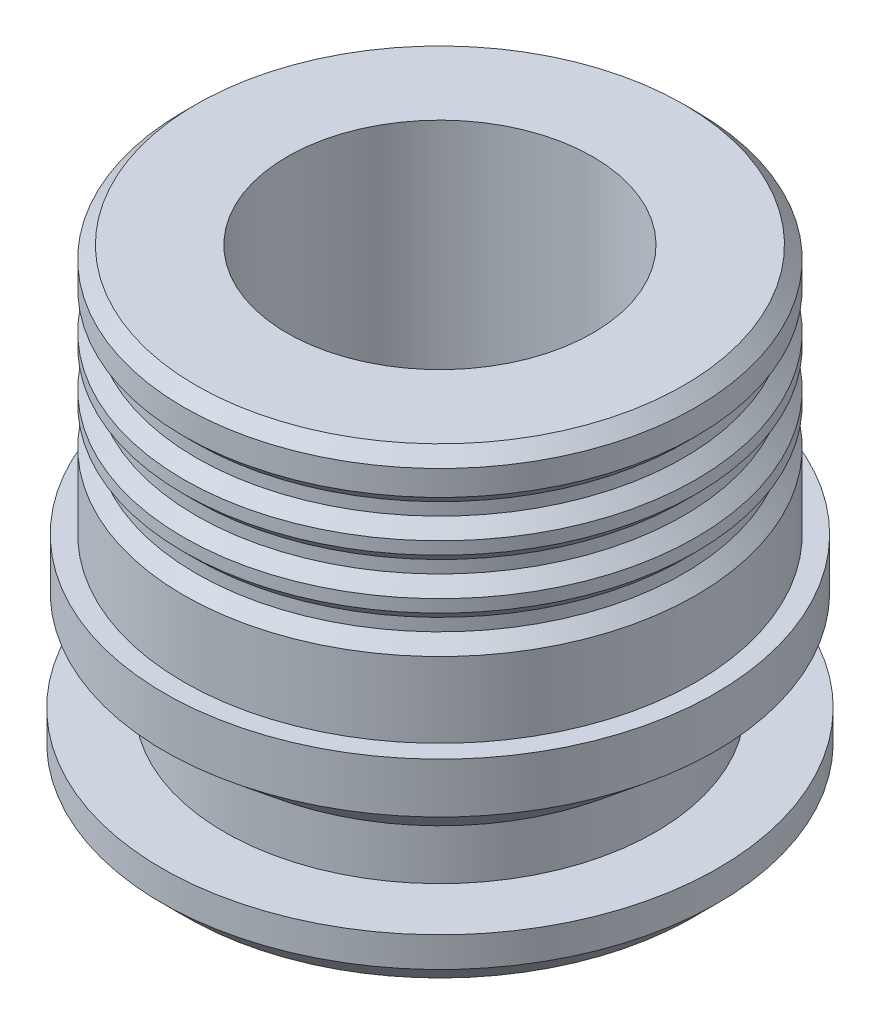
ISO-10303-21;
HEADER;
FILE_DESCRIPTION(('STEP AP214'),'2;1');
FILE_NAME('part.step','',(''),(''),'','','');
FILE_SCHEMA(('AUTOMOTIVE_DESIGN { 1 0 10303 214 1 1 1 1 }'));
ENDSEC;
DATA;
#1=APPLICATION_CONTEXT('core data for automotive mechanical design processes');
#2=APPLICATION_PROTOCOL_DEFINITION('international standard','automotive_design',2000,#1);
#3=PRODUCT_CONTEXT('',#1,'mechanical');
#4=PRODUCT('Part','Part','',(#3));
#5=PRODUCT_RELATED_PRODUCT_CATEGORY('part','',(#4));
#6=PRODUCT_DEFINITION_FORMATION('','',#4);
#7=PRODUCT_DEFINITION_CONTEXT('part definition',#1,'design');
#8=PRODUCT_DEFINITION('design','',#6,#7);
#9=PRODUCT_DEFINITION_SHAPE('','',#8);
#10=(LENGTH_UNIT() NAMED_UNIT(*) SI_UNIT(.MILLI.,.METRE.));
#11=(NAMED_UNIT(*) PLANE_ANGLE_UNIT() SI_UNIT($,.RADIAN.));
#12=(NAMED_UNIT(*) SI_UNIT($,.STERADIAN.) SOLID_ANGLE_UNIT());
#13=UNCERTAINTY_MEASURE_WITH_UNIT(LENGTH_MEASURE(1.E-05),#10,'distance_accuracy_value','');
#14=(GEOMETRIC_REPRESENTATION_CONTEXT(3) GLOBAL_UNCERTAINTY_ASSIGNED_CONTEXT((#13)) GLOBAL_UNIT_ASSIGNED_CONTEXT((#10,
#11,#12)) REPRESENTATION_CONTEXT('',''));
#15=CARTESIAN_POINT('',(0.,0.,0.));
#16=DIRECTION('',(0.,0.,1.));
#17=DIRECTION('',(1.,0.,0.));
#18=AXIS2_PLACEMENT_3D('',#15,#16,#17);
#19=CARTESIAN_POINT('',(0.,0.,-11.1));
#20=DIRECTION('',(0.,-1.,0.));
#21=DIRECTION('',(0.,0.,-1.));
#22=AXIS2_PLACEMENT_3D('',#19,#20,#21);
#23=PLANE('',#22);
#24=CARTESIAN_POINT('',(0.,0.,0.));
#25=DIRECTION('',(0.,-1.,0.));
#26=DIRECTION('',(0.,0.,-1.));
#27=AXIS2_PLACEMENT_3D('',#24,#25,#26);
#28=CIRCLE('',#27,6.6);
#29=CARTESIAN_POINT('',(0.,0.,-6.6));
#30=VERTEX_POINT('',#29);
#31=EDGE_CURVE('E10',#30,#30,#28,.F.);
#32=ORIENTED_EDGE('',*,*,#31,.T.);
#33=EDGE_LOOP('',(#32));
#34=FACE_BOUND('',#33,.T.);
#35=CARTESIAN_POINT('',(0.,0.,0.));
#36=DIRECTION('',(0.,-1.,0.));
#37=DIRECTION('',(0.,0.,-1.));
#38=AXIS2_PLACEMENT_3D('',#35,#36,#37);
#39=CIRCLE('',#38,10.1);
#40=CARTESIAN_POINT('',(0.,0.,-10.1));
#41=VERTEX_POINT('',#40);
#42=EDGE_CURVE('E54',#41,#41,#39,.T.);
#43=ORIENTED_EDGE('',*,*,#42,.T.);
#44=EDGE_LOOP('',(#43));
#45=FACE_BOUND('',#44,.T.);
#46=ADVANCED_FACE('F31',(#34,#45),#23,.T.);
#47=CARTESIAN_POINT('',(0.,0.,0.));
#48=DIRECTION('',(0.,-1.,0.));
#49=DIRECTION('',(0.,0.,-1.));
#50=AXIS2_PLACEMENT_3D('',#47,#48,#49);
#51=CYLINDRICAL_SURFACE('',#50,6.1);
#52=CARTESIAN_POINT('',(0.,0.499999999999995,0.));
#53=DIRECTION('',(0.,-1.,0.));
#54=DIRECTION('',(0.,0.,-1.));
#55=AXIS2_PLACEMENT_3D('',#52,#53,#54);
#56=CIRCLE('',#55,6.1);
#57=CARTESIAN_POINT('',(0.,0.499999999999995,-6.1));
#58=VERTEX_POINT('',#57);
#59=EDGE_CURVE('E38',#58,#58,#56,.T.);
#60=ORIENTED_EDGE('',*,*,#59,.T.);
#61=EDGE_LOOP('',(#60));
#62=FACE_BOUND('',#61,.T.);
#63=CARTESIAN_POINT('',(0.,18.2,0.));
#64=DIRECTION('',(0.,-1.,0.));
#65=DIRECTION('',(0.,0.,-1.));
#66=AXIS2_PLACEMENT_3D('',#63,#64,#65);
#67=CIRCLE('',#66,6.1);
#68=CARTESIAN_POINT('',(0.,18.2,-6.1));
#69=VERTEX_POINT('',#68);
#70=EDGE_CURVE('E57',#69,#69,#67,.T.);
#71=ORIENTED_EDGE('',*,*,#70,.F.);
#72=EDGE_LOOP('',(#71));
#73=FACE_BOUND('',#72,.T.);
#74=ADVANCED_FACE('F133',(#62,#73),#51,.F.);
#75=CARTESIAN_POINT('',(0.,18.2,-6.1));
#76=DIRECTION('',(0.,1.,0.));
#77=DIRECTION('',(0.,0.,1.));
#78=AXIS2_PLACEMENT_3D('',#75,#76,#77);
#79=PLANE('',#78);
#80=CARTESIAN_POINT('',(0.,18.2,0.));
#81=DIRECTION('',(0.,1.,0.));
#82=DIRECTION('',(0.,0.,1.));
#83=AXIS2_PLACEMENT_3D('',#80,#81,#82);
#84=CIRCLE('',#83,9.72499999999999);
#85=CARTESIAN_POINT('',(0.,18.2,9.72499999999999));
#86=VERTEX_POINT('',#85);
#87=EDGE_CURVE('E42',#86,#86,#84,.T.);
#88=ORIENTED_EDGE('',*,*,#87,.T.);
#89=EDGE_LOOP('',(#88));
#90=FACE_BOUND('',#89,.T.);
#91=ORIENTED_EDGE('',*,*,#70,.T.);
#92=EDGE_LOOP('',(#91));
#93=FACE_BOUND('',#92,.T.);
#94=ADVANCED_FACE('F138',(#90,#93),#79,.T.);
#95=CARTESIAN_POINT('',(0.,0.,0.));
#96=DIRECTION('',(0.,-1.,0.));
#97=DIRECTION('',(0.,0.,-1.));
#98=AXIS2_PLACEMENT_3D('',#95,#96,#97);
#99=CYLINDRICAL_SURFACE('',#98,10.225);
#100=CARTESIAN_POINT('',(0.,17.7,0.));
#101=DIRECTION('',(0.,1.,0.));
#102=DIRECTION('',(0.,0.,1.));
#103=AXIS2_PLACEMENT_3D('',#100,#101,#102);
#104=CIRCLE('',#103,10.225);
#105=CARTESIAN_POINT('',(0.,17.7,10.225));
#106=VERTEX_POINT('',#105);
#107=EDGE_CURVE('E46',#106,#106,#104,.F.);
#108=ORIENTED_EDGE('',*,*,#107,.T.);
#109=EDGE_LOOP('',(#108));
#110=FACE_BOUND('',#109,.T.);
#111=CARTESIAN_POINT('',(0.,16.7,0.));
#112=DIRECTION('',(0.,-1.,0.));
#113=DIRECTION('',(0.,0.,-1.));
#114=AXIS2_PLACEMENT_3D('',#111,#112,#113);
#115=CIRCLE('',#114,10.225);
#116=CARTESIAN_POINT('',(0.,16.7,-10.225));
#117=VERTEX_POINT('',#116);
#118=EDGE_CURVE('E60',#117,#117,#115,.T.);
#119=ORIENTED_EDGE('',*,*,#118,.F.);
#120=EDGE_LOOP('',(#119));
#121=FACE_BOUND('',#120,.T.);
#122=ADVANCED_FACE('F156',(#110,#121),#99,.T.);
#123=CARTESIAN_POINT('',(0.,16.2000000492508,0.));
#124=DIRECTION('',(0.,1.,0.));
#125=DIRECTION('',(0.,0.,1.));
#126=AXIS2_PLACEMENT_3D('',#123,#124,#125);
#127=CONICAL_SURFACE('',#126,9.725,0.785398212648328);
#128=ORIENTED_EDGE('',*,*,#118,.T.);
#129=EDGE_LOOP('',(#128));
#130=FACE_BOUND('',#129,.T.);
#131=CARTESIAN_POINT('',(0.,16.2000000492508,0.));
#132=DIRECTION('',(0.,-1.,0.));
#133=DIRECTION('',(0.,0.,-1.));
#134=AXIS2_PLACEMENT_3D('',#131,#132,#133);
#135=CIRCLE('',#134,9.725);
#136=CARTESIAN_POINT('',(0.,16.2000000492508,-9.725));
#137=VERTEX_POINT('',#136);
#138=EDGE_CURVE('E63',#137,#137,#135,.T.);
#139=ORIENTED_EDGE('',*,*,#138,.F.);
#140=EDGE_LOOP('',(#139));
#141=FACE_BOUND('',#140,.T.);
#142=ADVANCED_FACE('F159',(#130,#141),#127,.T.);
#143=CARTESIAN_POINT('',(0.,0.,0.));
#144=DIRECTION('',(0.,-1.,0.));
#145=DIRECTION('',(0.,0.,-1.));
#146=AXIS2_PLACEMENT_3D('',#143,#144,#145);
#147=CYLINDRICAL_SURFACE('',#146,9.725);
#148=ORIENTED_EDGE('',*,*,#138,.T.);
#149=EDGE_LOOP('',(#148));
#150=FACE_BOUND('',#149,.T.);
#151=CARTESIAN_POINT('',(0.,15.7000000492509,0.));
#152=DIRECTION('',(0.,-1.,0.));
#153=DIRECTION('',(0.,0.,-1.));
#154=AXIS2_PLACEMENT_3D('',#151,#152,#153);
#155=CIRCLE('',#154,9.725);
#156=CARTESIAN_POINT('',(0.,15.7000000492509,-9.725));
#157=VERTEX_POINT('',#156);
#158=EDGE_CURVE('E66',#157,#157,#155,.T.);
#159=ORIENTED_EDGE('',*,*,#158,.F.);
#160=EDGE_LOOP('',(#159));
#161=FACE_BOUND('',#160,.T.);
#162=ADVANCED_FACE('F165',(#150,#161),#147,.T.);
#163=CARTESIAN_POINT('',(0.,15.2,0.));
#164=DIRECTION('',(0.,-1.,0.));
#165=DIRECTION('',(0.,0.,-1.));
#166=AXIS2_PLACEMENT_3D('',#163,#164,#165);
#167=CONICAL_SURFACE('',#166,10.225,0.785398114146577);
#168=ORIENTED_EDGE('',*,*,#158,.T.);
#169=EDGE_LOOP('',(#168));
#170=FACE_BOUND('',#169,.T.);
#171=CARTESIAN_POINT('',(0.,15.2,0.));
#172=DIRECTION('',(0.,-1.,0.));
#173=DIRECTION('',(0.,0.,-1.));
#174=AXIS2_PLACEMENT_3D('',#171,#172,#173);
#175=CIRCLE('',#174,10.225);
#176=CARTESIAN_POINT('',(0.,15.2,-10.225));
#177=VERTEX_POINT('',#176);
#178=EDGE_CURVE('E69',#177,#177,#175,.T.);
#179=ORIENTED_EDGE('',*,*,#178,.F.);
#180=EDGE_LOOP('',(#179));
#181=FACE_BOUND('',#180,.T.);
#182=ADVANCED_FACE('F171',(#170,#181),#167,.T.);
#183=CARTESIAN_POINT('',(0.,0.,0.));
#184=DIRECTION('',(0.,-1.,0.));
#185=DIRECTION('',(0.,0.,-1.));
#186=AXIS2_PLACEMENT_3D('',#183,#184,#185);
#187=CYLINDRICAL_SURFACE('',#186,10.225);
#188=ORIENTED_EDGE('',*,*,#178,.T.);
#189=EDGE_LOOP('',(#188));
#190=FACE_BOUND('',#189,.T.);
#191=CARTESIAN_POINT('',(0.,14.7,0.));
#192=DIRECTION('',(0.,-1.,0.));
#193=DIRECTION('',(0.,0.,-1.));
#194=AXIS2_PLACEMENT_3D('',#191,#192,#193);
#195=CIRCLE('',#194,10.225);
#196=CARTESIAN_POINT('',(0.,14.7,-10.225));
#197=VERTEX_POINT('',#196);
#198=EDGE_CURVE('E72',#197,#197,#195,.T.);
#199=ORIENTED_EDGE('',*,*,#198,.F.);
#200=EDGE_LOOP('',(#199));
#201=FACE_BOUND('',#200,.T.);
#202=ADVANCED_FACE('F177',(#190,#201),#187,.T.);
#203=CARTESIAN_POINT('',(0.,14.2000000492509,0.));
#204=DIRECTION('',(0.,1.,0.));
#205=DIRECTION('',(0.,0.,1.));
#206=AXIS2_PLACEMENT_3D('',#203,#204,#205);
#207=CONICAL_SURFACE('',#206,9.725,0.785398212648327);
#208=ORIENTED_EDGE('',*,*,#198,.T.);
#209=EDGE_LOOP('',(#208));
#210=FACE_BOUND('',#209,.T.);
#211=CARTESIAN_POINT('',(0.,14.2000000492509,0.));
#212=DIRECTION('',(0.,-1.,0.));
#213=DIRECTION('',(0.,0.,-1.));
#214=AXIS2_PLACEMENT_3D('',#211,#212,#213);
#215=CIRCLE('',#214,9.725);
#216=CARTESIAN_POINT('',(0.,14.2000000492509,-9.725));
#217=VERTEX_POINT('',#216);
#218=EDGE_CURVE('E75',#217,#217,#215,.T.);
#219=ORIENTED_EDGE('',*,*,#218,.F.);
#220=EDGE_LOOP('',(#219));
#221=FACE_BOUND('',#220,.T.);
#222=ADVANCED_FACE('F183',(#210,#221),#207,.T.);
#223=CARTESIAN_POINT('',(0.,0.,0.));
#224=DIRECTION('',(0.,-1.,0.));
#225=DIRECTION('',(0.,0.,-1.));
#226=AXIS2_PLACEMENT_3D('',#223,#224,#225);
#227=CYLINDRICAL_SURFACE('',#226,9.725);
#228=ORIENTED_EDGE('',*,*,#218,.T.);
#229=EDGE_LOOP('',(#228));
#230=FACE_BOUND('',#229,.T.);
#231=CARTESIAN_POINT('',(0.,13.7000000492509,0.));
#232=DIRECTION('',(0.,-1.,0.));
#233=DIRECTION('',(0.,0.,-1.));
#234=AXIS2_PLACEMENT_3D('',#231,#232,#233);
#235=CIRCLE('',#234,9.725);
#236=CARTESIAN_POINT('',(0.,13.7000000492509,-9.725));
#237=VERTEX_POINT('',#236);
#238=EDGE_CURVE('E78',#237,#237,#235,.T.);
#239=ORIENTED_EDGE('',*,*,#238,.F.);
#240=EDGE_LOOP('',(#239));
#241=FACE_BOUND('',#240,.T.);
#242=ADVANCED_FACE('F189',(#230,#241),#227,.T.);
#243=CARTESIAN_POINT('',(0.,13.2,0.));
#244=DIRECTION('',(0.,-1.,0.));
#245=DIRECTION('',(0.,0.,-1.));
#246=AXIS2_PLACEMENT_3D('',#243,#244,#245);
#247=CONICAL_SURFACE('',#246,10.225,0.785398114146577);
#248=ORIENTED_EDGE('',*,*,#238,.T.);
#249=EDGE_LOOP('',(#248));
#250=FACE_BOUND('',#249,.T.);
#251=CARTESIAN_POINT('',(0.,13.2,0.));
#252=DIRECTION('',(0.,-1.,0.));
#253=DIRECTION('',(0.,0.,-1.));
#254=AXIS2_PLACEMENT_3D('',#251,#252,#253);
#255=CIRCLE('',#254,10.225);
#256=CARTESIAN_POINT('',(0.,13.2,-10.225));
#257=VERTEX_POINT('',#256);
#258=EDGE_CURVE('E81',#257,#257,#255,.T.);
#259=ORIENTED_EDGE('',*,*,#258,.F.);
#260=EDGE_LOOP('',(#259));
#261=FACE_BOUND('',#260,.T.);
#262=ADVANCED_FACE('F195',(#250,#261),#247,.T.);
#263=CARTESIAN_POINT('',(0.,0.,0.));
#264=DIRECTION('',(0.,-1.,0.));
#265=DIRECTION('',(0.,0.,-1.));
#266=AXIS2_PLACEMENT_3D('',#263,#264,#265);
#267=CYLINDRICAL_SURFACE('',#266,10.225);
#268=ORIENTED_EDGE('',*,*,#258,.T.);
#269=EDGE_LOOP('',(#268));
#270=FACE_BOUND('',#269,.T.);
#271=CARTESIAN_POINT('',(0.,12.7,0.));
#272=DIRECTION('',(0.,-1.,0.));
#273=DIRECTION('',(0.,0.,-1.));
#274=AXIS2_PLACEMENT_3D('',#271,#272,#273);
#275=CIRCLE('',#274,10.225);
#276=CARTESIAN_POINT('',(0.,12.7,-10.225));
#277=VERTEX_POINT('',#276);
#278=EDGE_CURVE('E84',#277,#277,#275,.T.);
#279=ORIENTED_EDGE('',*,*,#278,.F.);
#280=EDGE_LOOP('',(#279));
#281=FACE_BOUND('',#280,.T.);
#282=ADVANCED_FACE('F201',(#270,#281),#267,.T.);
#283=CARTESIAN_POINT('',(0.,12.2000000492509,0.));
#284=DIRECTION('',(0.,1.,0.));
#285=DIRECTION('',(0.,0.,1.));
#286=AXIS2_PLACEMENT_3D('',#283,#284,#285);
#287=CONICAL_SURFACE('',#286,9.725,0.785398212648325);
#288=ORIENTED_EDGE('',*,*,#278,.T.);
#289=EDGE_LOOP('',(#288));
#290=FACE_BOUND('',#289,.T.);
#291=CARTESIAN_POINT('',(0.,12.2000000492509,0.));
#292=DIRECTION('',(0.,-1.,0.));
#293=DIRECTION('',(0.,0.,-1.));
#294=AXIS2_PLACEMENT_3D('',#291,#292,#293);
#295=CIRCLE('',#294,9.725);
#296=CARTESIAN_POINT('',(0.,12.2000000492509,-9.725));
#297=VERTEX_POINT('',#296);
#298=EDGE_CURVE('E87',#297,#297,#295,.T.);
#299=ORIENTED_EDGE('',*,*,#298,.F.);
#300=EDGE_LOOP('',(#299));
#301=FACE_BOUND('',#300,.T.);
#302=ADVANCED_FACE('F207',(#290,#301),#287,.T.);
#303=CARTESIAN_POINT('',(0.,0.,0.));
#304=DIRECTION('',(0.,-1.,0.));
#305=DIRECTION('',(0.,0.,-1.));
#306=AXIS2_PLACEMENT_3D('',#303,#304,#305);
#307=CYLINDRICAL_SURFACE('',#306,9.725);
#308=ORIENTED_EDGE('',*,*,#298,.T.);
#309=EDGE_LOOP('',(#308));
#310=FACE_BOUND('',#309,.T.);
#311=CARTESIAN_POINT('',(0.,11.7000000492509,0.));
#312=DIRECTION('',(0.,-1.,0.));
#313=DIRECTION('',(0.,0.,-1.));
#314=AXIS2_PLACEMENT_3D('',#311,#312,#313);
#315=CIRCLE('',#314,9.725);
#316=CARTESIAN_POINT('',(0.,11.7000000492509,-9.725));
#317=VERTEX_POINT('',#316);
#318=EDGE_CURVE('E90',#317,#317,#315,.T.);
#319=ORIENTED_EDGE('',*,*,#318,.F.);
#320=EDGE_LOOP('',(#319));
#321=FACE_BOUND('',#320,.T.);
#322=ADVANCED_FACE('F213',(#310,#321),#307,.T.);
#323=CARTESIAN_POINT('',(0.,11.2,0.));
#324=DIRECTION('',(0.,-1.,0.));
#325=DIRECTION('',(0.,0.,-1.));
#326=AXIS2_PLACEMENT_3D('',#323,#324,#325);
#327=CONICAL_SURFACE('',#326,10.225,0.785398114146577);
#328=ORIENTED_EDGE('',*,*,#318,.T.);
#329=EDGE_LOOP('',(#328));
#330=FACE_BOUND('',#329,.T.);
#331=CARTESIAN_POINT('',(0.,11.2,0.));
#332=DIRECTION('',(0.,-1.,0.));
#333=DIRECTION('',(0.,0.,-1.));
#334=AXIS2_PLACEMENT_3D('',#331,#332,#333);
#335=CIRCLE('',#334,10.225);
#336=CARTESIAN_POINT('',(0.,11.2,-10.225));
#337=VERTEX_POINT('',#336);
#338=EDGE_CURVE('E93',#337,#337,#335,.T.);
#339=ORIENTED_EDGE('',*,*,#338,.F.);
#340=EDGE_LOOP('',(#339));
#341=FACE_BOUND('',#340,.T.);
#342=ADVANCED_FACE('F219',(#330,#341),#327,.T.);
#343=CARTESIAN_POINT('',(0.,0.,0.));
#344=DIRECTION('',(0.,-1.,0.));
#345=DIRECTION('',(0.,0.,-1.));
#346=AXIS2_PLACEMENT_3D('',#343,#344,#345);
#347=CYLINDRICAL_SURFACE('',#346,10.225);
#348=ORIENTED_EDGE('',*,*,#338,.T.);
#349=EDGE_LOOP('',(#348));
#350=FACE_BOUND('',#349,.T.);
#351=CARTESIAN_POINT('',(0.,8.2,0.));
#352=DIRECTION('',(0.,-1.,0.));
#353=DIRECTION('',(0.,0.,-1.));
#354=AXIS2_PLACEMENT_3D('',#351,#352,#353);
#355=CIRCLE('',#354,10.225);
#356=CARTESIAN_POINT('',(0.,8.2,-10.225));
#357=VERTEX_POINT('',#356);
#358=EDGE_CURVE('E96',#357,#357,#355,.T.);
#359=ORIENTED_EDGE('',*,*,#358,.F.);
#360=EDGE_LOOP('',(#359));
#361=FACE_BOUND('',#360,.T.);
#362=ADVANCED_FACE('F225',(#350,#361),#347,.T.);
#363=CARTESIAN_POINT('',(0.,8.2,-10.225));
#364=DIRECTION('',(0.,1.,0.));
#365=DIRECTION('',(0.,0.,1.));
#366=AXIS2_PLACEMENT_3D('',#363,#364,#365);
#367=PLANE('',#366);
#368=ORIENTED_EDGE('',*,*,#358,.T.);
#369=EDGE_LOOP('',(#368));
#370=FACE_BOUND('',#369,.T.);
#371=CARTESIAN_POINT('',(0.,8.2,0.));
#372=DIRECTION('',(0.,-1.,0.));
#373=DIRECTION('',(0.,0.,-1.));
#374=AXIS2_PLACEMENT_3D('',#371,#372,#373);
#375=CIRCLE('',#374,11.);
#376=CARTESIAN_POINT('',(0.,8.2,-11.));
#377=VERTEX_POINT('',#376);
#378=EDGE_CURVE('E99',#377,#377,#375,.T.);
#379=ORIENTED_EDGE('',*,*,#378,.F.);
#380=EDGE_LOOP('',(#379));
#381=FACE_BOUND('',#380,.T.);
#382=ADVANCED_FACE('F231',(#370,#381),#367,.T.);
#383=CARTESIAN_POINT('',(0.,0.,0.));
#384=DIRECTION('',(0.,-1.,0.));
#385=DIRECTION('',(0.,0.,-1.));
#386=AXIS2_PLACEMENT_3D('',#383,#384,#385);
#387=CYLINDRICAL_SURFACE('',#386,11.);
#388=ORIENTED_EDGE('',*,*,#378,.T.);
#389=EDGE_LOOP('',(#388));
#390=FACE_BOUND('',#389,.T.);
#391=CARTESIAN_POINT('',(0.,6.2,0.));
#392=DIRECTION('',(0.,-1.,0.));
#393=DIRECTION('',(0.,0.,-1.));
#394=AXIS2_PLACEMENT_3D('',#391,#392,#393);
#395=CIRCLE('',#394,11.);
#396=CARTESIAN_POINT('',(0.,6.2,-11.));
#397=VERTEX_POINT('',#396);
#398=EDGE_CURVE('E102',#397,#397,#395,.T.);
#399=ORIENTED_EDGE('',*,*,#398,.F.);
#400=EDGE_LOOP('',(#399));
#401=FACE_BOUND('',#400,.T.);
#402=ADVANCED_FACE('F237',(#390,#401),#387,.T.);
#403=CARTESIAN_POINT('',(0.,4.2,0.));
#404=DIRECTION('',(0.,1.,0.));
#405=DIRECTION('',(0.,0.,1.));
#406=AXIS2_PLACEMENT_3D('',#403,#404,#405);
#407=CONICAL_SURFACE('',#406,8.6,0.876058050598194);
#408=ORIENTED_EDGE('',*,*,#398,.T.);
#409=EDGE_LOOP('',(#408));
#410=FACE_BOUND('',#409,.T.);
#411=CARTESIAN_POINT('',(0.,4.2,0.));
#412=DIRECTION('',(0.,-1.,0.));
#413=DIRECTION('',(0.,0.,-1.));
#414=AXIS2_PLACEMENT_3D('',#411,#412,#413);
#415=CIRCLE('',#414,8.6);
#416=CARTESIAN_POINT('',(0.,4.2,-8.6));
#417=VERTEX_POINT('',#416);
#418=EDGE_CURVE('E105',#417,#417,#415,.T.);
#419=ORIENTED_EDGE('',*,*,#418,.F.);
#420=EDGE_LOOP('',(#419));
#421=FACE_BOUND('',#420,.T.);
#422=ADVANCED_FACE('F129',(#410,#421),#407,.T.);
#423=CARTESIAN_POINT('',(0.,0.,0.));
#424=DIRECTION('',(0.,-1.,0.));
#425=DIRECTION('',(0.,0.,-1.));
#426=AXIS2_PLACEMENT_3D('',#423,#424,#425);
#427=CYLINDRICAL_SURFACE('',#426,8.6);
#428=ORIENTED_EDGE('',*,*,#418,.T.);
#429=EDGE_LOOP('',(#428));
#430=FACE_BOUND('',#429,.T.);
#431=CARTESIAN_POINT('',(0.,2.2,0.));
#432=DIRECTION('',(0.,-1.,0.));
#433=DIRECTION('',(0.,0.,-1.));
#434=AXIS2_PLACEMENT_3D('',#431,#432,#433);
#435=CIRCLE('',#434,8.6);
#436=CARTESIAN_POINT('',(0.,2.2,-8.6));
#437=VERTEX_POINT('',#436);
#438=EDGE_CURVE('E108',#437,#437,#435,.T.);
#439=ORIENTED_EDGE('',*,*,#438,.F.);
#440=EDGE_LOOP('',(#439));
#441=FACE_BOUND('',#440,.T.);
#442=ADVANCED_FACE('F119',(#430,#441),#427,.T.);
#443=CARTESIAN_POINT('',(0.,2.2,-8.6));
#444=DIRECTION('',(0.,1.,0.));
#445=DIRECTION('',(0.,0.,1.));
#446=AXIS2_PLACEMENT_3D('',#443,#444,#445);
#447=PLANE('',#446);
#448=ORIENTED_EDGE('',*,*,#438,.T.);
#449=EDGE_LOOP('',(#448));
#450=FACE_BOUND('',#449,.T.);
#451=CARTESIAN_POINT('',(0.,2.2,0.));
#452=DIRECTION('',(0.,-1.,0.));
#453=DIRECTION('',(0.,0.,-1.));
#454=AXIS2_PLACEMENT_3D('',#451,#452,#453);
#455=CIRCLE('',#454,11.1);
#456=CARTESIAN_POINT('',(0.,2.2,-11.1));
#457=VERTEX_POINT('',#456);
#458=EDGE_CURVE('E111',#457,#457,#455,.T.);
#459=ORIENTED_EDGE('',*,*,#458,.F.);
#460=EDGE_LOOP('',(#459));
#461=FACE_BOUND('',#460,.T.);
#462=ADVANCED_FACE('F117',(#450,#461),#447,.T.);
#463=CARTESIAN_POINT('',(0.,0.,0.));
#464=DIRECTION('',(0.,-1.,0.));
#465=DIRECTION('',(0.,0.,-1.));
#466=AXIS2_PLACEMENT_3D('',#463,#464,#465);
#467=CYLINDRICAL_SURFACE('',#466,11.1);
#468=CARTESIAN_POINT('',(0.,0.999999999999997,0.));
#469=DIRECTION('',(0.,-1.,0.));
#470=DIRECTION('',(0.,0.,-1.));
#471=AXIS2_PLACEMENT_3D('',#468,#469,#470);
#472=CIRCLE('',#471,11.1);
#473=CARTESIAN_POINT('',(0.,0.999999999999997,-11.1));
#474=VERTEX_POINT('',#473);
#475=EDGE_CURVE('E51',#474,#474,#472,.F.);
#476=ORIENTED_EDGE('',*,*,#475,.T.);
#477=EDGE_LOOP('',(#476));
#478=FACE_BOUND('',#477,.T.);
#479=ORIENTED_EDGE('',*,*,#458,.T.);
#480=EDGE_LOOP('',(#479));
#481=FACE_BOUND('',#480,.T.);
#482=ADVANCED_FACE('F115',(#478,#481),#467,.T.);
#483=CARTESIAN_POINT('',(0.,0.,0.));
#484=DIRECTION('',(0.,1.,0.));
#485=DIRECTION('',(0.,0.,1.));
#486=AXIS2_PLACEMENT_3D('',#483,#484,#485);
#487=CONICAL_SURFACE('',#486,10.1,0.785398163397445);
#488=ORIENTED_EDGE('',*,*,#475,.F.);
#489=EDGE_LOOP('',(#488));
#490=FACE_BOUND('',#489,.T.);
#491=ORIENTED_EDGE('',*,*,#42,.F.);
#492=EDGE_LOOP('',(#491));
#493=FACE_BOUND('',#492,.T.);
#494=ADVANCED_FACE('F126',(#490,#493),#487,.T.);
#495=CARTESIAN_POINT('',(0.,17.7,0.));
#496=DIRECTION('',(0.,-1.,0.));
#497=DIRECTION('',(0.,0.,-1.));
#498=AXIS2_PLACEMENT_3D('',#495,#496,#497);
#499=CONICAL_SURFACE('',#498,10.225,0.785398163397452);
#500=ORIENTED_EDGE('',*,*,#87,.F.);
#501=EDGE_LOOP('',(#500));
#502=FACE_BOUND('',#501,.T.);
#503=ORIENTED_EDGE('',*,*,#107,.F.);
#504=EDGE_LOOP('',(#503));
#505=FACE_BOUND('',#504,.T.);
#506=ADVANCED_FACE('F144',(#502,#505),#499,.T.);
#507=CARTESIAN_POINT('',(0.,0.499999999999995,0.));
#508=DIRECTION('',(0.,-1.,0.));
#509=DIRECTION('',(0.,0.,-1.));
#510=AXIS2_PLACEMENT_3D('',#507,#508,#509);
#511=CONICAL_SURFACE('',#510,6.1,0.785398163397452);
#512=ORIENTED_EDGE('',*,*,#31,.F.);
#513=EDGE_LOOP('',(#512));
#514=FACE_BOUND('',#513,.T.);
#515=ORIENTED_EDGE('',*,*,#59,.F.);
#516=EDGE_LOOP('',(#515));
#517=FACE_BOUND('',#516,.T.);
#518=ADVANCED_FACE('F33',(#514,#517),#511,.F.);
#519=CLOSED_SHELL('',(#46,#74,#94,#122,#142,#162,#182,#202,#222,#242,#262,#282,#302,#322,#342,
#362,#382,#402,#422,#442,#462,#482,#494,#506,#518));
#520=MANIFOLD_SOLID_BREP('B2',#519);
#521=ADVANCED_BREP_SHAPE_REPRESENTATION('',(#18,#520),#14);
#522=SHAPE_DEFINITION_REPRESENTATION(#9,#521);
ENDSEC;
END-ISO-10303-21;
